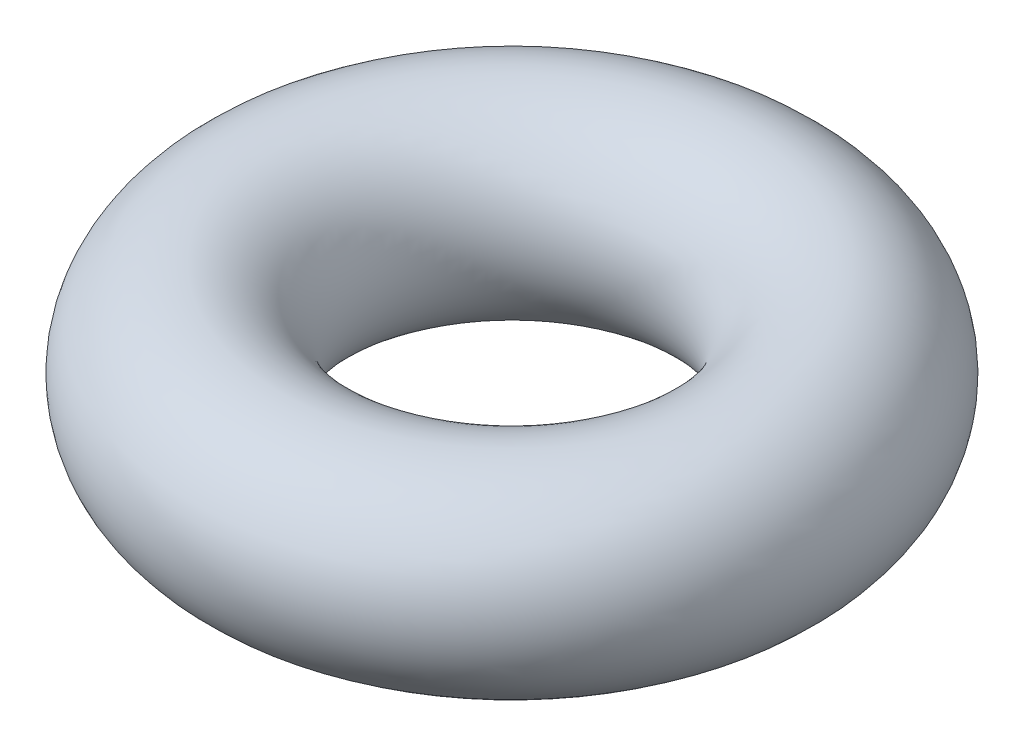
ISO-10303-21;
HEADER;
FILE_DESCRIPTION(('STEP AP214'),'2;1');
FILE_NAME('part.step','',(''),(''),'','','');
FILE_SCHEMA(('AUTOMOTIVE_DESIGN { 1 0 10303 214 1 1 1 1 }'));
ENDSEC;
DATA;
#1=APPLICATION_CONTEXT('core data for automotive mechanical design processes');
#2=APPLICATION_PROTOCOL_DEFINITION('international standard','automotive_design',2000,#1);
#3=PRODUCT_CONTEXT('',#1,'mechanical');
#4=PRODUCT('Part','Part','',(#3));
#5=PRODUCT_RELATED_PRODUCT_CATEGORY('part','',(#4));
#6=PRODUCT_DEFINITION_FORMATION('','',#4);
#7=PRODUCT_DEFINITION_CONTEXT('part definition',#1,'design');
#8=PRODUCT_DEFINITION('design','',#6,#7);
#9=PRODUCT_DEFINITION_SHAPE('','',#8);
#10=(LENGTH_UNIT() NAMED_UNIT(*) SI_UNIT(.MILLI.,.METRE.));
#11=(NAMED_UNIT(*) PLANE_ANGLE_UNIT() SI_UNIT($,.RADIAN.));
#12=(NAMED_UNIT(*) SI_UNIT($,.STERADIAN.) SOLID_ANGLE_UNIT());
#13=UNCERTAINTY_MEASURE_WITH_UNIT(LENGTH_MEASURE(1.E-05),#10,'distance_accuracy_value','');
#14=(GEOMETRIC_REPRESENTATION_CONTEXT(3) GLOBAL_UNCERTAINTY_ASSIGNED_CONTEXT((#13)) GLOBAL_UNIT_ASSIGNED_CONTEXT((#10,
#11,#12)) REPRESENTATION_CONTEXT('',''));
#15=CARTESIAN_POINT('',(0.,0.,0.));
#16=DIRECTION('',(0.,0.,1.));
#17=DIRECTION('',(1.,0.,0.));
#18=AXIS2_PLACEMENT_3D('',#15,#16,#17);
#19=CARTESIAN_POINT('',(0.,0.,0.));
#20=DIRECTION('',(0.,-1.,0.));
#21=DIRECTION('',(0.,0.,-1.));
#22=AXIS2_PLACEMENT_3D('',#19,#20,#21);
#23=TOROIDAL_SURFACE('',#22,60.,25.);
#24=CARTESIAN_POINT('',(0.,0.,-85.));
#25=VERTEX_POINT('',#24);
#26=VERTEX_LOOP('',#25);
#27=FACE_BOUND('',#26,.T.);
#28=ADVANCED_FACE('F36',(#27),#23,.T.);
#29=CLOSED_SHELL('',(#28));
#30=CARTESIAN_POINT('',(0.,0.,0.));
#31=DIRECTION('',(0.,-1.,0.));
#32=DIRECTION('',(0.,0.,-1.));
#33=AXIS2_PLACEMENT_3D('',#30,#31,#32);
#34=TOROIDAL_SURFACE('',#33,60.,12.5);
#35=CARTESIAN_POINT('',(0.,0.,-72.5));
#36=VERTEX_POINT('',#35);
#37=VERTEX_LOOP('',#36);
#38=FACE_BOUND('',#37,.T.);
#39=ADVANCED_FACE('F49',(#38),#34,.F.);
#40=CLOSED_SHELL('',(#39));
#41=ORIENTED_CLOSED_SHELL('',*,#40,.T.);
#42=BREP_WITH_VOIDS('B2',#29,(#41));
#43=ADVANCED_BREP_SHAPE_REPRESENTATION('',(#18,#42),#14);
#44=SHAPE_DEFINITION_REPRESENTATION(#9,#43);
ENDSEC;
END-ISO-10303-21;
